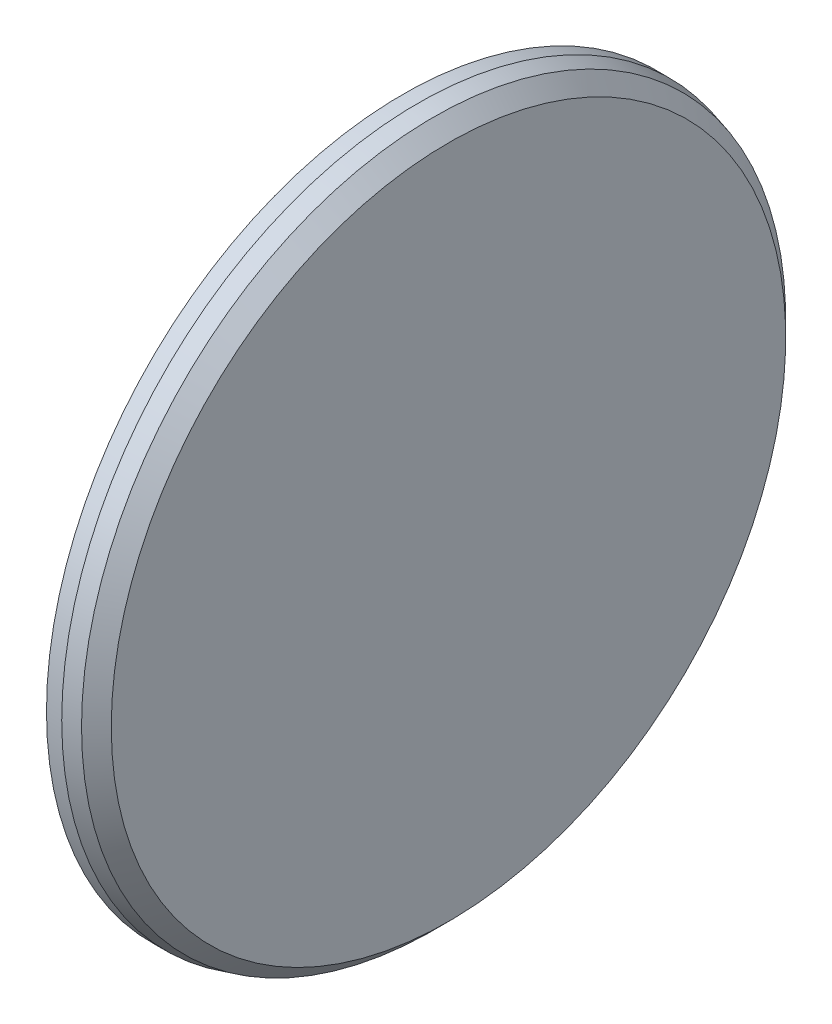
ISO-10303-21;
HEADER;
FILE_DESCRIPTION(('STEP AP214'),'2;1');
FILE_NAME('part.step','',(''),(''),'','','');
FILE_SCHEMA(('AUTOMOTIVE_DESIGN { 1 0 10303 214 1 1 1 1 }'));
ENDSEC;
DATA;
#1=APPLICATION_CONTEXT('core data for automotive mechanical design processes');
#2=APPLICATION_PROTOCOL_DEFINITION('international standard','automotive_design',2000,#1);
#3=PRODUCT_CONTEXT('',#1,'mechanical');
#4=PRODUCT('Part','Part','',(#3));
#5=PRODUCT_RELATED_PRODUCT_CATEGORY('part','',(#4));
#6=PRODUCT_DEFINITION_FORMATION('','',#4);
#7=PRODUCT_DEFINITION_CONTEXT('part definition',#1,'design');
#8=PRODUCT_DEFINITION('design','',#6,#7);
#9=PRODUCT_DEFINITION_SHAPE('','',#8);
#10=(LENGTH_UNIT() NAMED_UNIT(*) SI_UNIT(.MILLI.,.METRE.));
#11=(NAMED_UNIT(*) PLANE_ANGLE_UNIT() SI_UNIT($,.RADIAN.));
#12=(NAMED_UNIT(*) SI_UNIT($,.STERADIAN.) SOLID_ANGLE_UNIT());
#13=UNCERTAINTY_MEASURE_WITH_UNIT(LENGTH_MEASURE(1.E-05),#10,'distance_accuracy_value','');
#14=(GEOMETRIC_REPRESENTATION_CONTEXT(3) GLOBAL_UNCERTAINTY_ASSIGNED_CONTEXT((#13)) GLOBAL_UNIT_ASSIGNED_CONTEXT((#10,
#11,#12)) REPRESENTATION_CONTEXT('',''));
#15=CARTESIAN_POINT('',(0.,0.,0.));
#16=DIRECTION('',(0.,0.,1.));
#17=DIRECTION('',(1.,0.,0.));
#18=AXIS2_PLACEMENT_3D('',#15,#16,#17);
#19=CARTESIAN_POINT('',(0.,0.,-467.5));
#20=DIRECTION('',(1.,0.,0.));
#21=DIRECTION('',(0.,0.,-1.));
#22=AXIS2_PLACEMENT_3D('',#19,#20,#21);
#23=PLANE('',#22);
#24=CARTESIAN_POINT('',(0.,0.,0.));
#25=DIRECTION('',(-1.,0.,0.));
#26=DIRECTION('',(0.,0.,1.));
#27=AXIS2_PLACEMENT_3D('',#24,#25,#26);
#28=CIRCLE('',#27,422.5);
#29=CARTESIAN_POINT('',(0.,0.,422.5));
#30=VERTEX_POINT('',#29);
#31=EDGE_CURVE('E50',#30,#30,#28,.T.);
#32=ORIENTED_EDGE('',*,*,#31,.F.);
#33=EDGE_LOOP('',(#32));
#34=FACE_BOUND('',#33,.T.);
#35=CARTESIAN_POINT('',(0.,0.,0.));
#36=DIRECTION('',(-1.,0.,0.));
#37=DIRECTION('',(0.,0.,1.));
#38=AXIS2_PLACEMENT_3D('',#35,#36,#37);
#39=CIRCLE('',#38,467.5);
#40=CARTESIAN_POINT('',(0.,0.,467.5));
#41=VERTEX_POINT('',#40);
#42=EDGE_CURVE('E61',#41,#41,#39,.T.);
#43=ORIENTED_EDGE('',*,*,#42,.T.);
#44=EDGE_LOOP('',(#43));
#45=FACE_BOUND('',#44,.T.);
#46=ADVANCED_FACE('F43',(#34,#45),#23,.F.);
#47=CARTESIAN_POINT('',(60.0000000000001,0.,0.));
#48=DIRECTION('',(-1.,0.,0.));
#49=DIRECTION('',(0.,0.,1.));
#50=AXIS2_PLACEMENT_3D('',#47,#48,#49);
#51=PLANE('',#50);
#52=CARTESIAN_POINT('',(60.0000000000001,0.,0.));
#53=DIRECTION('',(-1.,0.,0.));
#54=DIRECTION('',(0.,0.,1.));
#55=AXIS2_PLACEMENT_3D('',#52,#53,#54);
#56=CIRCLE('',#55,442.5);
#57=CARTESIAN_POINT('',(60.0000000000001,0.,442.5));
#58=VERTEX_POINT('',#57);
#59=EDGE_CURVE('E63',#58,#58,#56,.T.);
#60=ORIENTED_EDGE('',*,*,#59,.F.);
#61=EDGE_LOOP('',(#60));
#62=FACE_BOUND('',#61,.T.);
#63=ADVANCED_FACE('F72',(#62),#51,.F.);
#64=CARTESIAN_POINT('',(60.0000000000001,0.,0.));
#65=DIRECTION('',(-1.,0.,0.));
#66=DIRECTION('',(0.,0.,1.));
#67=AXIS2_PLACEMENT_3D('',#64,#65,#66);
#68=CONICAL_SURFACE('',#67,442.5,0.785398163397443);
#69=CARTESIAN_POINT('',(40.4903810567661,0.,0.));
#70=DIRECTION('',(-1.,0.,0.));
#71=DIRECTION('',(0.,0.,1.));
#72=AXIS2_PLACEMENT_3D('',#69,#70,#71);
#73=CIRCLE('',#72,462.009618943234);
#74=CARTESIAN_POINT('',(40.4903810567661,0.,462.009618943234));
#75=VERTEX_POINT('',#74);
#76=EDGE_CURVE('E58',#75,#75,#73,.T.);
#77=ORIENTED_EDGE('',*,*,#76,.F.);
#78=EDGE_LOOP('',(#77));
#79=FACE_BOUND('',#78,.T.);
#80=ORIENTED_EDGE('',*,*,#59,.T.);
#81=EDGE_LOOP('',(#80));
#82=FACE_BOUND('',#81,.T.);
#83=ADVANCED_FACE('F70',(#79,#82),#68,.T.);
#84=CARTESIAN_POINT('',(40.4903810567661,0.,0.));
#85=DIRECTION('',(-1.,0.,0.));
#86=DIRECTION('',(0.,0.,1.));
#87=AXIS2_PLACEMENT_3D('',#84,#85,#86);
#88=CONICAL_SURFACE('',#87,462.009618943234,0.26179938779914);
#89=CARTESIAN_POINT('',(20.,0.,0.));
#90=DIRECTION('',(-1.,0.,0.));
#91=DIRECTION('',(0.,0.,1.));
#92=AXIS2_PLACEMENT_3D('',#89,#90,#91);
#93=CIRCLE('',#92,467.5);
#94=CARTESIAN_POINT('',(20.,0.,467.5));
#95=VERTEX_POINT('',#94);
#96=EDGE_CURVE('E54',#95,#95,#93,.T.);
#97=ORIENTED_EDGE('',*,*,#96,.F.);
#98=EDGE_LOOP('',(#97));
#99=FACE_BOUND('',#98,.T.);
#100=ORIENTED_EDGE('',*,*,#76,.T.);
#101=EDGE_LOOP('',(#100));
#102=FACE_BOUND('',#101,.T.);
#103=ADVANCED_FACE('F79',(#99,#102),#88,.T.);
#104=CARTESIAN_POINT('',(0.,0.,0.));
#105=DIRECTION('',(-1.,0.,0.));
#106=DIRECTION('',(0.,0.,1.));
#107=AXIS2_PLACEMENT_3D('',#104,#105,#106);
#108=CYLINDRICAL_SURFACE('',#107,467.5);
#109=ORIENTED_EDGE('',*,*,#42,.F.);
#110=EDGE_LOOP('',(#109));
#111=FACE_BOUND('',#110,.T.);
#112=ORIENTED_EDGE('',*,*,#96,.T.);
#113=EDGE_LOOP('',(#112));
#114=FACE_BOUND('',#113,.T.);
#115=ADVANCED_FACE('F87',(#111,#114),#108,.T.);
#116=CARTESIAN_POINT('',(30.,0.,0.));
#117=DIRECTION('',(-1.,0.,0.));
#118=DIRECTION('',(0.,0.,1.));
#119=AXIS2_PLACEMENT_3D('',#116,#117,#118);
#120=CYLINDRICAL_SURFACE('',#119,422.5);
#121=CARTESIAN_POINT('',(30.,0.,0.));
#122=DIRECTION('',(-1.,0.,0.));
#123=DIRECTION('',(0.,0.,1.));
#124=AXIS2_PLACEMENT_3D('',#121,#122,#123);
#125=CIRCLE('',#124,422.5);
#126=CARTESIAN_POINT('',(30.,0.,422.5));
#127=VERTEX_POINT('',#126);
#128=EDGE_CURVE('E11',#127,#127,#125,.T.);
#129=ORIENTED_EDGE('',*,*,#128,.F.);
#130=EDGE_LOOP('',(#129));
#131=FACE_BOUND('',#130,.T.);
#132=ORIENTED_EDGE('',*,*,#31,.T.);
#133=EDGE_LOOP('',(#132));
#134=FACE_BOUND('',#133,.T.);
#135=ADVANCED_FACE('F90',(#131,#134),#120,.F.);
#136=CARTESIAN_POINT('',(30.,0.,0.));
#137=DIRECTION('',(-1.,0.,0.));
#138=DIRECTION('',(0.,0.,1.));
#139=AXIS2_PLACEMENT_3D('',#136,#137,#138);
#140=PLANE('',#139);
#141=ORIENTED_EDGE('',*,*,#128,.T.);
#142=EDGE_LOOP('',(#141));
#143=FACE_BOUND('',#142,.T.);
#144=ADVANCED_FACE('F45',(#143),#140,.T.);
#145=CLOSED_SHELL('',(#46,#63,#83,#103,#115,#135,#144));
#146=MANIFOLD_SOLID_BREP('B2',#145);
#147=CARTESIAN_POINT('',(-20.,0.,0.));
#148=DIRECTION('',(-1.,0.,0.));
#149=DIRECTION('',(0.,0.,1.));
#150=AXIS2_PLACEMENT_3D('',#147,#148,#149);
#151=PLANE('',#150);
#152=CARTESIAN_POINT('',(-20.,0.,0.));
#153=DIRECTION('',(-1.,0.,0.));
#154=DIRECTION('',(0.,0.,1.));
#155=AXIS2_PLACEMENT_3D('',#152,#153,#154);
#156=CIRCLE('',#155,100.);
#157=CARTESIAN_POINT('',(-20.,0.,100.));
#158=VERTEX_POINT('',#157);
#159=EDGE_CURVE('E42',#158,#158,#156,.T.);
#160=ORIENTED_EDGE('',*,*,#159,.T.);
#161=EDGE_LOOP('',(#160));
#162=FACE_BOUND('',#161,.T.);
#163=ADVANCED_FACE('F144',(#162),#151,.T.);
#164=CARTESIAN_POINT('',(-20.,0.,0.));
#165=DIRECTION('',(1.,0.,0.));
#166=DIRECTION('',(0.,0.,-1.));
#167=AXIS2_PLACEMENT_3D('',#164,#165,#166);
#168=CYLINDRICAL_SURFACE('',#167,100.);
#169=ORIENTED_EDGE('',*,*,#159,.F.);
#170=EDGE_LOOP('',(#169));
#171=FACE_BOUND('',#170,.T.);
#172=CARTESIAN_POINT('',(0.,0.,0.));
#173=DIRECTION('',(-1.,0.,0.));
#174=DIRECTION('',(0.,0.,1.));
#175=AXIS2_PLACEMENT_3D('',#172,#173,#174);
#176=CIRCLE('',#175,100.);
#177=CARTESIAN_POINT('',(0.,0.,100.));
#178=VERTEX_POINT('',#177);
#179=EDGE_CURVE('E151',#178,#178,#176,.T.);
#180=ORIENTED_EDGE('',*,*,#179,.T.);
#181=EDGE_LOOP('',(#180));
#182=FACE_BOUND('',#181,.T.);
#183=ADVANCED_FACE('F146',(#171,#182),#168,.T.);
#184=CARTESIAN_POINT('',(0.,0.,0.));
#185=DIRECTION('',(-1.,0.,0.));
#186=DIRECTION('',(0.,0.,1.));
#187=AXIS2_PLACEMENT_3D('',#184,#185,#186);
#188=PLANE('',#187);
#189=ORIENTED_EDGE('',*,*,#179,.F.);
#190=EDGE_LOOP('',(#189));
#191=FACE_BOUND('',#190,.T.);
#192=ADVANCED_FACE('F158',(#191),#188,.F.);
#193=CLOSED_SHELL('',(#163,#183,#192));
#194=MANIFOLD_SOLID_BREP('B6',#193);
#195=ADVANCED_BREP_SHAPE_REPRESENTATION('',(#18,#146,#194),#14);
#196=SHAPE_DEFINITION_REPRESENTATION(#9,#195);
ENDSEC;
END-ISO-10303-21;
